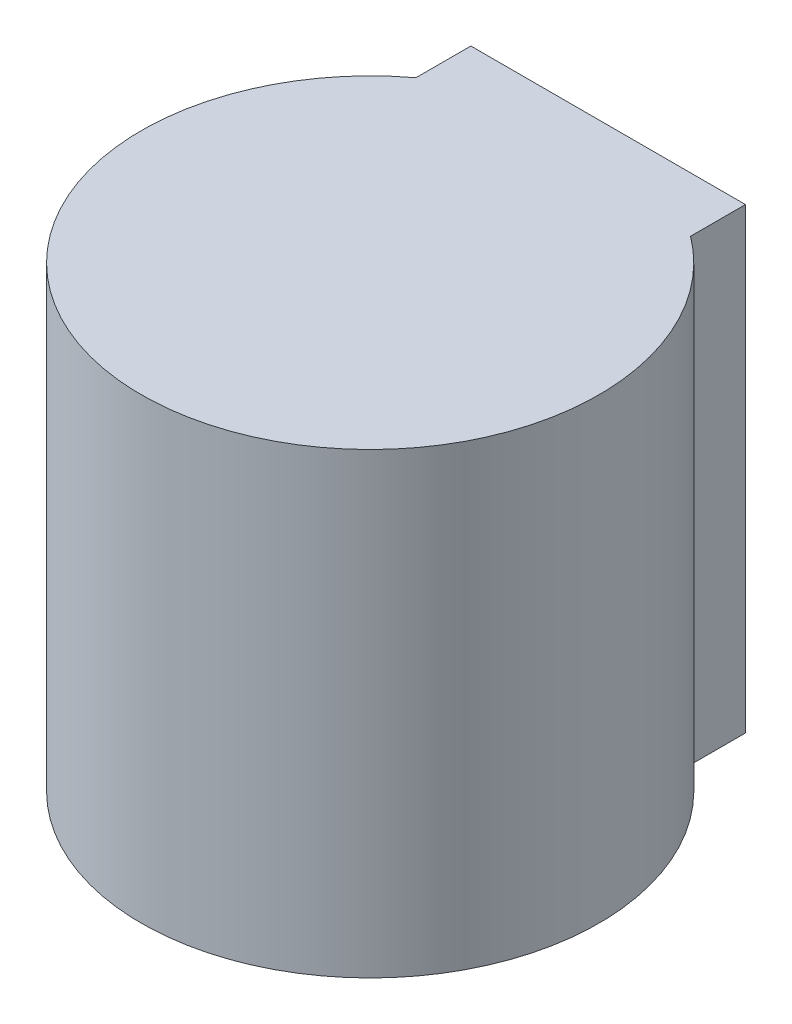
ISO-10303-21;
HEADER;
FILE_DESCRIPTION(('STEP AP214'),'2;1');
FILE_NAME('part.step','',(''),(''),'','','');
FILE_SCHEMA(('AUTOMOTIVE_DESIGN { 1 0 10303 214 1 1 1 1 }'));
ENDSEC;
DATA;
#1=APPLICATION_CONTEXT('core data for automotive mechanical design processes');
#2=APPLICATION_PROTOCOL_DEFINITION('international standard','automotive_design',2000,#1);
#3=PRODUCT_CONTEXT('',#1,'mechanical');
#4=PRODUCT('Part','Part','',(#3));
#5=PRODUCT_RELATED_PRODUCT_CATEGORY('part','',(#4));
#6=PRODUCT_DEFINITION_FORMATION('','',#4);
#7=PRODUCT_DEFINITION_CONTEXT('part definition',#1,'design');
#8=PRODUCT_DEFINITION('design','',#6,#7);
#9=PRODUCT_DEFINITION_SHAPE('','',#8);
#10=(LENGTH_UNIT() NAMED_UNIT(*) SI_UNIT(.MILLI.,.METRE.));
#11=(NAMED_UNIT(*) PLANE_ANGLE_UNIT() SI_UNIT($,.RADIAN.));
#12=(NAMED_UNIT(*) SI_UNIT($,.STERADIAN.) SOLID_ANGLE_UNIT());
#13=UNCERTAINTY_MEASURE_WITH_UNIT(LENGTH_MEASURE(1.E-05),#10,'distance_accuracy_value','');
#14=(GEOMETRIC_REPRESENTATION_CONTEXT(3) GLOBAL_UNCERTAINTY_ASSIGNED_CONTEXT((#13)) GLOBAL_UNIT_ASSIGNED_CONTEXT((#10,
#11,#12)) REPRESENTATION_CONTEXT('',''));
#15=CARTESIAN_POINT('',(0.,0.,0.));
#16=DIRECTION('',(0.,0.,1.));
#17=DIRECTION('',(1.,0.,0.));
#18=AXIS2_PLACEMENT_3D('',#15,#16,#17);
#19=CARTESIAN_POINT('',(0.,500.,0.));
#20=DIRECTION('',(0.,-1.,0.));
#21=DIRECTION('',(0.,0.,-1.));
#22=AXIS2_PLACEMENT_3D('',#19,#20,#21);
#23=CYLINDRICAL_SURFACE('',#22,250.);
#24=CARTESIAN_POINT('',(0.,500.,0.));
#25=DIRECTION('',(0.,1.,0.));
#26=DIRECTION('',(0.,0.,1.));
#27=AXIS2_PLACEMENT_3D('',#24,#25,#26);
#28=CIRCLE('',#27,250.);
#29=CARTESIAN_POINT('',(-150.,500.,-200.));
#30=VERTEX_POINT('',#29);
#31=CARTESIAN_POINT('',(150.,500.,-200.));
#32=VERTEX_POINT('',#31);
#33=EDGE_CURVE('E11',#30,#32,#28,.T.);
#34=ORIENTED_EDGE('',*,*,#33,.F.);
#35=DIRECTION('',(0.,-1.,0.));
#36=VECTOR('',#35,1.);
#37=CARTESIAN_POINT('',(-150.,500.,-200.));
#38=LINE('',#37,#36);
#39=CARTESIAN_POINT('',(-150.,0.,-200.));
#40=VERTEX_POINT('',#39);
#41=EDGE_CURVE('E118',#30,#40,#38,.T.);
#42=ORIENTED_EDGE('',*,*,#41,.T.);
#43=CARTESIAN_POINT('',(0.,0.,0.));
#44=DIRECTION('',(0.,1.,0.));
#45=DIRECTION('',(0.,0.,1.));
#46=AXIS2_PLACEMENT_3D('',#43,#44,#45);
#47=CIRCLE('',#46,250.);
#48=CARTESIAN_POINT('',(150.,0.,-200.));
#49=VERTEX_POINT('',#48);
#50=EDGE_CURVE('E41',#40,#49,#47,.T.);
#51=ORIENTED_EDGE('',*,*,#50,.T.);
#52=DIRECTION('',(0.,-1.,0.));
#53=VECTOR('',#52,1.);
#54=CARTESIAN_POINT('',(150.,500.,-200.));
#55=LINE('',#54,#53);
#56=EDGE_CURVE('E56',#49,#32,#55,.F.);
#57=ORIENTED_EDGE('',*,*,#56,.T.);
#58=EDGE_LOOP('',(#34,#42,#51,#57));
#59=FACE_BOUND('',#58,.T.);
#60=ADVANCED_FACE('F38',(#59),#23,.T.);
#61=CARTESIAN_POINT('',(0.,500.,0.));
#62=DIRECTION('',(0.,1.,0.));
#63=DIRECTION('',(0.,0.,1.));
#64=AXIS2_PLACEMENT_3D('',#61,#62,#63);
#65=PLANE('',#64);
#66=ORIENTED_EDGE('',*,*,#33,.T.);
#67=DIRECTION('',(0.,0.,1.));
#68=VECTOR('',#67,1.);
#69=CARTESIAN_POINT('',(150.,500.,-260.));
#70=LINE('',#69,#68);
#71=CARTESIAN_POINT('',(150.,500.,-260.));
#72=VERTEX_POINT('',#71);
#73=EDGE_CURVE('E110',#72,#32,#70,.T.);
#74=ORIENTED_EDGE('',*,*,#73,.F.);
#75=DIRECTION('',(-1.,0.,0.));
#76=VECTOR('',#75,1.);
#77=CARTESIAN_POINT('',(-150.,500.,-260.));
#78=LINE('',#77,#76);
#79=CARTESIAN_POINT('',(-150.,500.,-260.));
#80=VERTEX_POINT('',#79);
#81=EDGE_CURVE('E85',#72,#80,#78,.T.);
#82=ORIENTED_EDGE('',*,*,#81,.T.);
#83=DIRECTION('',(0.,0.,1.));
#84=VECTOR('',#83,1.);
#85=CARTESIAN_POINT('',(-150.,500.,-260.));
#86=LINE('',#85,#84);
#87=EDGE_CURVE('E100',#80,#30,#86,.T.);
#88=ORIENTED_EDGE('',*,*,#87,.T.);
#89=EDGE_LOOP('',(#66,#74,#82,#88));
#90=FACE_BOUND('',#89,.T.);
#91=ADVANCED_FACE('F124',(#90),#65,.T.);
#92=CARTESIAN_POINT('',(0.,0.,0.));
#93=DIRECTION('',(0.,1.,0.));
#94=DIRECTION('',(0.,0.,1.));
#95=AXIS2_PLACEMENT_3D('',#92,#93,#94);
#96=PLANE('',#95);
#97=ORIENTED_EDGE('',*,*,#50,.F.);
#98=DIRECTION('',(0.,0.,1.));
#99=VECTOR('',#98,1.);
#100=CARTESIAN_POINT('',(-150.,0.,-260.));
#101=LINE('',#100,#99);
#102=CARTESIAN_POINT('',(-150.,0.,-260.));
#103=VERTEX_POINT('',#102);
#104=EDGE_CURVE('E76',#103,#40,#101,.T.);
#105=ORIENTED_EDGE('',*,*,#104,.F.);
#106=DIRECTION('',(1.,0.,0.));
#107=VECTOR('',#106,1.);
#108=CARTESIAN_POINT('',(-150.,0.,-260.));
#109=LINE('',#108,#107);
#110=CARTESIAN_POINT('',(150.,0.,-260.));
#111=VERTEX_POINT('',#110);
#112=EDGE_CURVE('E80',#103,#111,#109,.T.);
#113=ORIENTED_EDGE('',*,*,#112,.T.);
#114=DIRECTION('',(0.,0.,1.));
#115=VECTOR('',#114,1.);
#116=CARTESIAN_POINT('',(150.,0.,-260.));
#117=LINE('',#116,#115);
#118=EDGE_CURVE('E84',#111,#49,#117,.T.);
#119=ORIENTED_EDGE('',*,*,#118,.T.);
#120=EDGE_LOOP('',(#97,#105,#113,#119));
#121=FACE_BOUND('',#120,.T.);
#122=ADVANCED_FACE('F78',(#121),#96,.F.);
#123=CARTESIAN_POINT('',(-150.,500.,-260.));
#124=DIRECTION('',(-1.,0.,0.));
#125=DIRECTION('',(0.,-1.,0.));
#126=AXIS2_PLACEMENT_3D('',#123,#124,#125);
#127=PLANE('',#126);
#128=ORIENTED_EDGE('',*,*,#41,.F.);
#129=ORIENTED_EDGE('',*,*,#87,.F.);
#130=DIRECTION('',(0.,-1.,0.));
#131=VECTOR('',#130,1.);
#132=CARTESIAN_POINT('',(-150.,500.,-260.));
#133=LINE('',#132,#131);
#134=EDGE_CURVE('E92',#80,#103,#133,.T.);
#135=ORIENTED_EDGE('',*,*,#134,.T.);
#136=ORIENTED_EDGE('',*,*,#104,.T.);
#137=EDGE_LOOP('',(#128,#129,#135,#136));
#138=FACE_BOUND('',#137,.T.);
#139=ADVANCED_FACE('F98',(#138),#127,.T.);
#140=CARTESIAN_POINT('',(150.,500.,-260.));
#141=DIRECTION('',(1.,0.,0.));
#142=DIRECTION('',(0.,1.,0.));
#143=AXIS2_PLACEMENT_3D('',#140,#141,#142);
#144=PLANE('',#143);
#145=ORIENTED_EDGE('',*,*,#56,.F.);
#146=ORIENTED_EDGE('',*,*,#118,.F.);
#147=DIRECTION('',(0.,1.,0.));
#148=VECTOR('',#147,1.);
#149=CARTESIAN_POINT('',(150.,500.,-260.));
#150=LINE('',#149,#148);
#151=EDGE_CURVE('E95',#111,#72,#150,.T.);
#152=ORIENTED_EDGE('',*,*,#151,.T.);
#153=ORIENTED_EDGE('',*,*,#73,.T.);
#154=EDGE_LOOP('',(#145,#146,#152,#153));
#155=FACE_BOUND('',#154,.T.);
#156=ADVANCED_FACE('F122',(#155),#144,.T.);
#157=CARTESIAN_POINT('',(0.,0.,-260.));
#158=DIRECTION('',(0.,0.,1.));
#159=DIRECTION('',(1.,0.,0.));
#160=AXIS2_PLACEMENT_3D('',#157,#158,#159);
#161=PLANE('',#160);
#162=ORIENTED_EDGE('',*,*,#134,.F.);
#163=ORIENTED_EDGE('',*,*,#81,.F.);
#164=ORIENTED_EDGE('',*,*,#151,.F.);
#165=ORIENTED_EDGE('',*,*,#112,.F.);
#166=EDGE_LOOP('',(#162,#163,#164,#165));
#167=FACE_BOUND('',#166,.T.);
#168=ADVANCED_FACE('F90',(#167),#161,.F.);
#169=CLOSED_SHELL('',(#60,#91,#122,#139,#156,#168));
#170=MANIFOLD_SOLID_BREP('B2',#169);
#171=ADVANCED_BREP_SHAPE_REPRESENTATION('',(#18,#170),#14);
#172=SHAPE_DEFINITION_REPRESENTATION(#9,#171);
ENDSEC;
END-ISO-10303-21;
